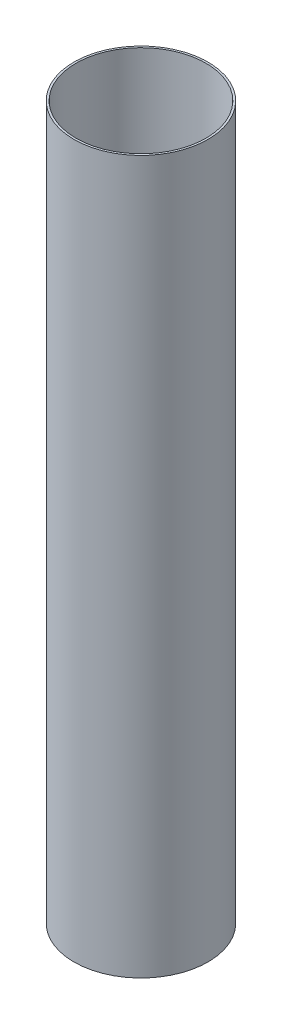
ISO-10303-21;
HEADER;
FILE_DESCRIPTION(('STEP AP214'),'2;1');
FILE_NAME('part.step','',(''),(''),'','','');
FILE_SCHEMA(('AUTOMOTIVE_DESIGN { 1 0 10303 214 1 1 1 1 }'));
ENDSEC;
DATA;
#1=APPLICATION_CONTEXT('core data for automotive mechanical design processes');
#2=APPLICATION_PROTOCOL_DEFINITION('international standard','automotive_design',2000,#1);
#3=PRODUCT_CONTEXT('',#1,'mechanical');
#4=PRODUCT('Part','Part','',(#3));
#5=PRODUCT_RELATED_PRODUCT_CATEGORY('part','',(#4));
#6=PRODUCT_DEFINITION_FORMATION('','',#4);
#7=PRODUCT_DEFINITION_CONTEXT('part definition',#1,'design');
#8=PRODUCT_DEFINITION('design','',#6,#7);
#9=PRODUCT_DEFINITION_SHAPE('','',#8);
#10=(LENGTH_UNIT() NAMED_UNIT(*) SI_UNIT(.MILLI.,.METRE.));
#11=(NAMED_UNIT(*) PLANE_ANGLE_UNIT() SI_UNIT($,.RADIAN.));
#12=(NAMED_UNIT(*) SI_UNIT($,.STERADIAN.) SOLID_ANGLE_UNIT());
#13=UNCERTAINTY_MEASURE_WITH_UNIT(LENGTH_MEASURE(1.E-05),#10,'distance_accuracy_value','');
#14=(GEOMETRIC_REPRESENTATION_CONTEXT(3) GLOBAL_UNCERTAINTY_ASSIGNED_CONTEXT((#13)) GLOBAL_UNIT_ASSIGNED_CONTEXT((#10,
#11,#12)) REPRESENTATION_CONTEXT('',''));
#15=CARTESIAN_POINT('',(0.,0.,0.));
#16=DIRECTION('',(0.,0.,1.));
#17=DIRECTION('',(1.,0.,0.));
#18=AXIS2_PLACEMENT_3D('',#15,#16,#17);
#19=CARTESIAN_POINT('',(0.,558.8,0.));
#20=DIRECTION('',(0.,1.,0.));
#21=DIRECTION('',(0.,0.,1.));
#22=AXIS2_PLACEMENT_3D('',#19,#20,#21);
#23=PLANE('',#22);
#24=CARTESIAN_POINT('',(0.,558.8,0.));
#25=DIRECTION('',(0.,1.,0.));
#26=DIRECTION('',(0.,0.,1.));
#27=AXIS2_PLACEMENT_3D('',#24,#25,#26);
#28=CIRCLE('',#27,52.578);
#29=CARTESIAN_POINT('',(0.,558.8,52.578));
#30=VERTEX_POINT('',#29);
#31=EDGE_CURVE('E10',#30,#30,#28,.T.);
#32=ORIENTED_EDGE('',*,*,#31,.T.);
#33=EDGE_LOOP('',(#32));
#34=FACE_BOUND('',#33,.T.);
#35=CARTESIAN_POINT('',(0.,558.8,0.));
#36=DIRECTION('',(0.,1.,0.));
#37=DIRECTION('',(0.,0.,1.));
#38=AXIS2_PLACEMENT_3D('',#35,#36,#37);
#39=CIRCLE('',#38,50.9905);
#40=CARTESIAN_POINT('',(0.,558.8,50.9905));
#41=VERTEX_POINT('',#40);
#42=EDGE_CURVE('E52',#41,#41,#39,.T.);
#43=ORIENTED_EDGE('',*,*,#42,.F.);
#44=EDGE_LOOP('',(#43));
#45=FACE_BOUND('',#44,.T.);
#46=ADVANCED_FACE('F37',(#34,#45),#23,.T.);
#47=CARTESIAN_POINT('',(0.,0.,0.));
#48=DIRECTION('',(0.,1.,0.));
#49=DIRECTION('',(0.,0.,1.));
#50=AXIS2_PLACEMENT_3D('',#47,#48,#49);
#51=PLANE('',#50);
#52=CARTESIAN_POINT('',(0.,0.,0.));
#53=DIRECTION('',(0.,1.,0.));
#54=DIRECTION('',(0.,0.,1.));
#55=AXIS2_PLACEMENT_3D('',#52,#53,#54);
#56=CIRCLE('',#55,52.578);
#57=CARTESIAN_POINT('',(0.,0.,52.578));
#58=VERTEX_POINT('',#57);
#59=EDGE_CURVE('E41',#58,#58,#56,.T.);
#60=ORIENTED_EDGE('',*,*,#59,.F.);
#61=EDGE_LOOP('',(#60));
#62=FACE_BOUND('',#61,.T.);
#63=CARTESIAN_POINT('',(0.,0.,0.));
#64=DIRECTION('',(0.,1.,0.));
#65=DIRECTION('',(0.,0.,1.));
#66=AXIS2_PLACEMENT_3D('',#63,#64,#65);
#67=CIRCLE('',#66,50.9905);
#68=CARTESIAN_POINT('',(0.,0.,50.9905));
#69=VERTEX_POINT('',#68);
#70=EDGE_CURVE('E54',#69,#69,#67,.T.);
#71=ORIENTED_EDGE('',*,*,#70,.T.);
#72=EDGE_LOOP('',(#71));
#73=FACE_BOUND('',#72,.T.);
#74=ADVANCED_FACE('F64',(#62,#73),#51,.F.);
#75=CARTESIAN_POINT('',(0.,558.8,0.));
#76=DIRECTION('',(0.,-1.,0.));
#77=DIRECTION('',(0.,0.,-1.));
#78=AXIS2_PLACEMENT_3D('',#75,#76,#77);
#79=CYLINDRICAL_SURFACE('',#78,52.578);
#80=ORIENTED_EDGE('',*,*,#31,.F.);
#81=EDGE_LOOP('',(#80));
#82=FACE_BOUND('',#81,.T.);
#83=ORIENTED_EDGE('',*,*,#59,.T.);
#84=EDGE_LOOP('',(#83));
#85=FACE_BOUND('',#84,.T.);
#86=ADVANCED_FACE('F39',(#82,#85),#79,.T.);
#87=CARTESIAN_POINT('',(0.,558.8,0.));
#88=DIRECTION('',(0.,-1.,0.));
#89=DIRECTION('',(0.,0.,-1.));
#90=AXIS2_PLACEMENT_3D('',#87,#88,#89);
#91=CYLINDRICAL_SURFACE('',#90,50.9905);
#92=ORIENTED_EDGE('',*,*,#42,.T.);
#93=EDGE_LOOP('',(#92));
#94=FACE_BOUND('',#93,.T.);
#95=ORIENTED_EDGE('',*,*,#70,.F.);
#96=EDGE_LOOP('',(#95));
#97=FACE_BOUND('',#96,.T.);
#98=ADVANCED_FACE('F60',(#94,#97),#91,.F.);
#99=CLOSED_SHELL('',(#46,#74,#86,#98));
#100=MANIFOLD_SOLID_BREP('B2',#99);
#101=ADVANCED_BREP_SHAPE_REPRESENTATION('',(#18,#100),#14);
#102=SHAPE_DEFINITION_REPRESENTATION(#9,#101);
ENDSEC;
END-ISO-10303-21;
